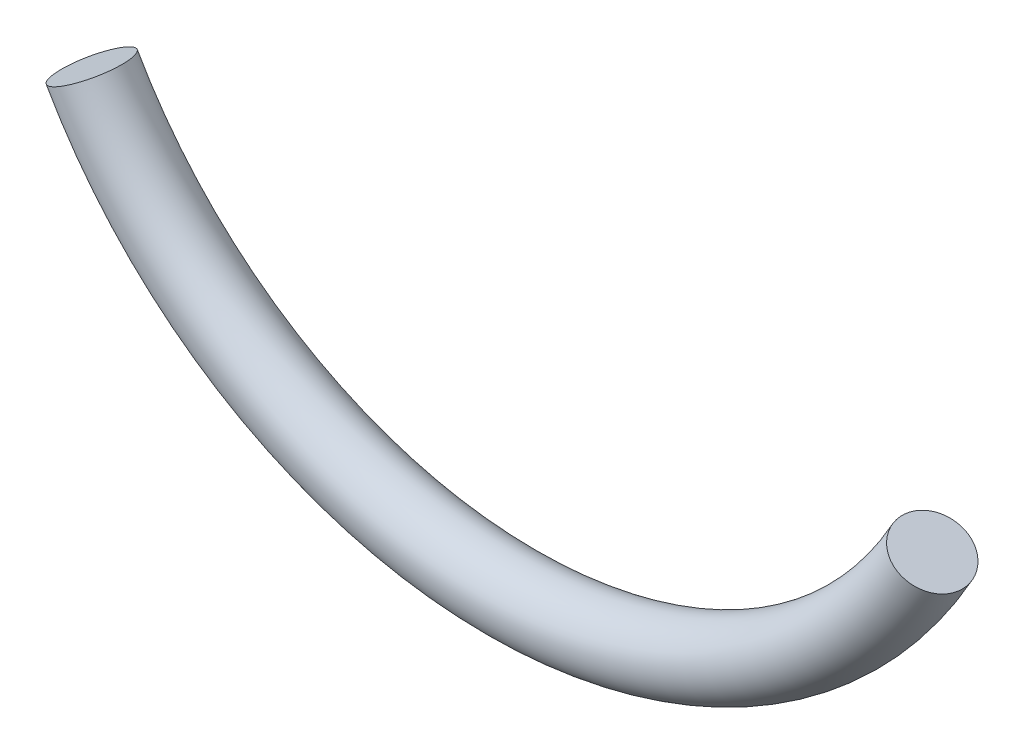
ISO-10303-21;
HEADER;
FILE_DESCRIPTION(('STEP AP214'),'2;1');
FILE_NAME('part.step','',(''),(''),'','','');
FILE_SCHEMA(('AUTOMOTIVE_DESIGN { 1 0 10303 214 1 1 1 1 }'));
ENDSEC;
DATA;
#1=APPLICATION_CONTEXT('core data for automotive mechanical design processes');
#2=APPLICATION_PROTOCOL_DEFINITION('international standard','automotive_design',2000,#1);
#3=PRODUCT_CONTEXT('',#1,'mechanical');
#4=PRODUCT('Part','Part','',(#3));
#5=PRODUCT_RELATED_PRODUCT_CATEGORY('part','',(#4));
#6=PRODUCT_DEFINITION_FORMATION('','',#4);
#7=PRODUCT_DEFINITION_CONTEXT('part definition',#1,'design');
#8=PRODUCT_DEFINITION('design','',#6,#7);
#9=PRODUCT_DEFINITION_SHAPE('','',#8);
#10=(LENGTH_UNIT() NAMED_UNIT(*) SI_UNIT(.MILLI.,.METRE.));
#11=(NAMED_UNIT(*) PLANE_ANGLE_UNIT() SI_UNIT($,.RADIAN.));
#12=(NAMED_UNIT(*) SI_UNIT($,.STERADIAN.) SOLID_ANGLE_UNIT());
#13=UNCERTAINTY_MEASURE_WITH_UNIT(LENGTH_MEASURE(1.E-05),#10,'distance_accuracy_value','');
#14=(GEOMETRIC_REPRESENTATION_CONTEXT(3) GLOBAL_UNCERTAINTY_ASSIGNED_CONTEXT((#13)) GLOBAL_UNIT_ASSIGNED_CONTEXT((#10,
#11,#12)) REPRESENTATION_CONTEXT('',''));
#15=CARTESIAN_POINT('',(0.,0.,0.));
#16=DIRECTION('',(0.,0.,1.));
#17=DIRECTION('',(1.,0.,0.));
#18=AXIS2_PLACEMENT_3D('',#15,#16,#17);
#19=CARTESIAN_POINT('',(-174.923849041708,-109.841525958286,219.825000100003));
#20=DIRECTION('',(0.491526274307117,-0.870862745595289,0.));
#21=DIRECTION('',(0.870862745595289,0.491526274307117,0.));
#22=AXIS2_PLACEMENT_3D('',#19,#20,#21);
#23=PLANE('',#22);
#24=CARTESIAN_POINT('',(-174.923849041708,-109.841525958286,219.825000100003));
#25=DIRECTION('',(0.491526274307117,-0.870862745595289,0.));
#26=DIRECTION('',(0.870862745595289,0.491526274307117,0.));
#27=AXIS2_PLACEMENT_3D('',#24,#25,#26);
#28=CIRCLE('',#27,3.17499999999999);
#29=CARTESIAN_POINT('',(-177.688838258973,-111.402121879211,219.825000100003));
#30=VERTEX_POINT('',#29);
#31=EDGE_CURVE('E53',#30,#30,#28,.T.);
#32=ORIENTED_EDGE('',*,*,#31,.F.);
#33=EDGE_LOOP('',(#32));
#34=FACE_BOUND('',#33,.T.);
#35=ADVANCED_FACE('F47',(#34),#23,.F.);
#36=CARTESIAN_POINT('',(-97.5041509582896,-109.84152595829,219.8250001));
#37=DIRECTION('',(0.491526274307208,0.870862745595238,0.));
#38=DIRECTION('',(-0.870862745595238,0.491526274307208,0.));
#39=AXIS2_PLACEMENT_3D('',#36,#37,#38);
#40=PLANE('',#39);
#41=CARTESIAN_POINT('',(-97.5041509582896,-109.84152595829,219.8250001));
#42=DIRECTION('',(0.491526274307208,0.870862745595238,0.));
#43=DIRECTION('',(-0.870862745595238,0.491526274307208,0.));
#44=AXIS2_PLACEMENT_3D('',#41,#42,#43);
#45=CIRCLE('',#44,3.17499999999999);
#46=CARTESIAN_POINT('',(-94.7391617410247,-111.402121879216,219.8250001));
#47=VERTEX_POINT('',#46);
#48=EDGE_CURVE('E11',#47,#47,#45,.T.);
#49=ORIENTED_EDGE('',*,*,#48,.T.);
#50=EDGE_LOOP('',(#49));
#51=FACE_BOUND('',#50,.T.);
#52=ADVANCED_FACE('F62',(#51),#40,.T.);
#53=CARTESIAN_POINT('',(-136.213999999998,-87.993183065335,219.825000100001));
#54=DIRECTION('',(0.,0.,1.));
#55=DIRECTION('',(1.,0.,0.));
#56=AXIS2_PLACEMENT_3D('',#53,#54,#55);
#57=TOROIDAL_SURFACE('',#56,44.4499999999999,3.17499999999999);
#58=CARTESIAN_POINT('',(-136.213999999998,-87.993183065335,219.825000100001));
#59=DIRECTION('',(0.,0.,1.));
#60=DIRECTION('',(1.,0.,0.));
#61=AXIS2_PLACEMENT_3D('',#58,#59,#60);
#62=CIRCLE('',#61,47.6249999999999);
#63=EDGE_CURVE('',#30,#47,#62,.T.);
#64=ORIENTED_EDGE('',*,*,#31,.T.);
#65=ORIENTED_EDGE('',*,*,#48,.F.);
#66=ORIENTED_EDGE('',*,*,#63,.T.);
#67=ORIENTED_EDGE('',*,*,#63,.F.);
#68=EDGE_LOOP('',(#64,#66,#65,#67));
#69=FACE_BOUND('',#68,.T.);
#70=ADVANCED_FACE('F59',(#69),#57,.T.);
#71=CLOSED_SHELL('',(#35,#52,#70));
#72=MANIFOLD_SOLID_BREP('B2',#71);
#73=ADVANCED_BREP_SHAPE_REPRESENTATION('',(#18,#72),#14);
#74=SHAPE_DEFINITION_REPRESENTATION(#9,#73);
ENDSEC;
END-ISO-10303-21;
